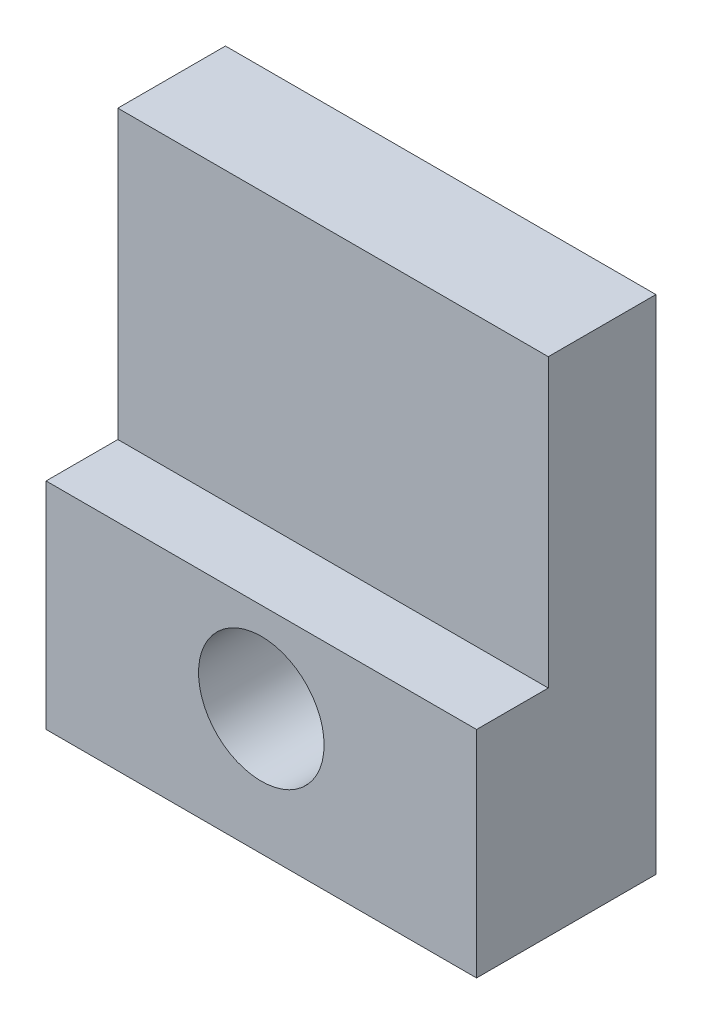
ISO-10303-21;
HEADER;
FILE_DESCRIPTION(('STEP AP214'),'2;1');
FILE_NAME('part.step','',(''),(''),'','','');
FILE_SCHEMA(('AUTOMOTIVE_DESIGN { 1 0 10303 214 1 1 1 1 }'));
ENDSEC;
DATA;
#1=APPLICATION_CONTEXT('core data for automotive mechanical design processes');
#2=APPLICATION_PROTOCOL_DEFINITION('international standard','automotive_design',2000,#1);
#3=PRODUCT_CONTEXT('',#1,'mechanical');
#4=PRODUCT('Part','Part','',(#3));
#5=PRODUCT_RELATED_PRODUCT_CATEGORY('part','',(#4));
#6=PRODUCT_DEFINITION_FORMATION('','',#4);
#7=PRODUCT_DEFINITION_CONTEXT('part definition',#1,'design');
#8=PRODUCT_DEFINITION('design','',#6,#7);
#9=PRODUCT_DEFINITION_SHAPE('','',#8);
#10=(LENGTH_UNIT() NAMED_UNIT(*) SI_UNIT(.MILLI.,.METRE.));
#11=(NAMED_UNIT(*) PLANE_ANGLE_UNIT() SI_UNIT($,.RADIAN.));
#12=(NAMED_UNIT(*) SI_UNIT($,.STERADIAN.) SOLID_ANGLE_UNIT());
#13=UNCERTAINTY_MEASURE_WITH_UNIT(LENGTH_MEASURE(1.E-05),#10,'distance_accuracy_value','');
#14=(GEOMETRIC_REPRESENTATION_CONTEXT(3) GLOBAL_UNCERTAINTY_ASSIGNED_CONTEXT((#13)) GLOBAL_UNIT_ASSIGNED_CONTEXT((#10,
#11,#12)) REPRESENTATION_CONTEXT('',''));
#15=CARTESIAN_POINT('',(0.,0.,0.));
#16=DIRECTION('',(0.,0.,1.));
#17=DIRECTION('',(1.,0.,0.));
#18=AXIS2_PLACEMENT_3D('',#15,#16,#17);
#19=CARTESIAN_POINT('',(-6.00000000000001,7.,5.));
#20=DIRECTION('',(0.,0.,1.));
#21=DIRECTION('',(1.,0.,0.));
#22=AXIS2_PLACEMENT_3D('',#19,#20,#21);
#23=PLANE('',#22);
#24=DIRECTION('',(1.,0.,0.));
#25=VECTOR('',#24,1.);
#26=CARTESIAN_POINT('',(-8.27233997512634,-0.999999999999997,5.));
#27=LINE('',#26,#25);
#28=CARTESIAN_POINT('',(-6.00000000000001,-1.,5.));
#29=VERTEX_POINT('',#28);
#30=CARTESIAN_POINT('',(6.00000000000001,-0.999999999999984,5.));
#31=VERTEX_POINT('',#30);
#32=EDGE_CURVE('E86',#29,#31,#27,.T.);
#33=ORIENTED_EDGE('',*,*,#32,.F.);
#34=DIRECTION('',(0.,-1.,0.));
#35=VECTOR('',#34,1.);
#36=CARTESIAN_POINT('',(-6.00000000000001,7.,5.));
#37=LINE('',#36,#35);
#38=CARTESIAN_POINT('',(-5.99999999999998,-7.00000000000001,5.));
#39=VERTEX_POINT('',#38);
#40=EDGE_CURVE('E95',#29,#39,#37,.T.);
#41=ORIENTED_EDGE('',*,*,#40,.T.);
#42=DIRECTION('',(1.,0.,0.));
#43=VECTOR('',#42,1.);
#44=CARTESIAN_POINT('',(-5.99999999999998,-7.00000000000001,5.));
#45=LINE('',#44,#43);
#46=CARTESIAN_POINT('',(6.00000000000004,-6.99999999999999,5.));
#47=VERTEX_POINT('',#46);
#48=EDGE_CURVE('E51',#39,#47,#45,.T.);
#49=ORIENTED_EDGE('',*,*,#48,.T.);
#50=DIRECTION('',(0.,1.,0.));
#51=VECTOR('',#50,1.);
#52=CARTESIAN_POINT('',(6.00000000000001,7.00000000000003,5.));
#53=LINE('',#52,#51);
#54=EDGE_CURVE('E97',#47,#31,#53,.T.);
#55=ORIENTED_EDGE('',*,*,#54,.T.);
#56=EDGE_LOOP('',(#33,#41,#49,#55));
#57=FACE_BOUND('',#56,.T.);
#58=CARTESIAN_POINT('',(0.,-3.50000000000001,5.));
#59=DIRECTION('',(0.,0.,1.));
#60=DIRECTION('',(1.,0.,0.));
#61=AXIS2_PLACEMENT_3D('',#58,#59,#60);
#62=CIRCLE('',#61,1.75);
#63=CARTESIAN_POINT('',(1.75,-3.50000000000001,5.));
#64=VERTEX_POINT('',#63);
#65=EDGE_CURVE('E134',#64,#64,#62,.T.);
#66=ORIENTED_EDGE('',*,*,#65,.F.);
#67=EDGE_LOOP('',(#66));
#68=FACE_BOUND('',#67,.T.);
#69=ADVANCED_FACE('F28',(#57,#68),#23,.T.);
#70=CARTESIAN_POINT('',(-6.00000000000001,7.,0.));
#71=DIRECTION('',(0.,0.,1.));
#72=DIRECTION('',(1.,0.,0.));
#73=AXIS2_PLACEMENT_3D('',#70,#71,#72);
#74=PLANE('',#73);
#75=DIRECTION('',(0.,-1.,0.));
#76=VECTOR('',#75,1.);
#77=CARTESIAN_POINT('',(-6.00000000000001,7.,0.));
#78=LINE('',#77,#76);
#79=CARTESIAN_POINT('',(-6.00000000000001,7.,0.));
#80=VERTEX_POINT('',#79);
#81=CARTESIAN_POINT('',(-5.99999999999998,-7.00000000000001,0.));
#82=VERTEX_POINT('',#81);
#83=EDGE_CURVE('E133',#80,#82,#78,.T.);
#84=ORIENTED_EDGE('',*,*,#83,.F.);
#85=DIRECTION('',(-1.,0.,0.));
#86=VECTOR('',#85,1.);
#87=CARTESIAN_POINT('',(-6.00000000000001,7.,0.));
#88=LINE('',#87,#86);
#89=CARTESIAN_POINT('',(6.00000000000001,7.00000000000003,0.));
#90=VERTEX_POINT('',#89);
#91=EDGE_CURVE('E103',#90,#80,#88,.T.);
#92=ORIENTED_EDGE('',*,*,#91,.F.);
#93=DIRECTION('',(0.,1.,0.));
#94=VECTOR('',#93,1.);
#95=CARTESIAN_POINT('',(6.00000000000001,7.00000000000003,0.));
#96=LINE('',#95,#94);
#97=CARTESIAN_POINT('',(6.00000000000004,-6.99999999999999,0.));
#98=VERTEX_POINT('',#97);
#99=EDGE_CURVE('E107',#98,#90,#96,.T.);
#100=ORIENTED_EDGE('',*,*,#99,.F.);
#101=DIRECTION('',(1.,0.,0.));
#102=VECTOR('',#101,1.);
#103=CARTESIAN_POINT('',(-5.99999999999998,-7.00000000000001,0.));
#104=LINE('',#103,#102);
#105=EDGE_CURVE('E129',#82,#98,#104,.T.);
#106=ORIENTED_EDGE('',*,*,#105,.F.);
#107=EDGE_LOOP('',(#84,#92,#100,#106));
#108=FACE_BOUND('',#107,.T.);
#109=CARTESIAN_POINT('',(0.,-3.50000000000001,0.));
#110=DIRECTION('',(0.,0.,1.));
#111=DIRECTION('',(1.,0.,0.));
#112=AXIS2_PLACEMENT_3D('',#109,#110,#111);
#113=CIRCLE('',#112,1.75);
#114=CARTESIAN_POINT('',(1.75,-3.50000000000001,0.));
#115=VERTEX_POINT('',#114);
#116=EDGE_CURVE('E91',#115,#115,#113,.T.);
#117=ORIENTED_EDGE('',*,*,#116,.T.);
#118=EDGE_LOOP('',(#117));
#119=FACE_BOUND('',#118,.T.);
#120=ADVANCED_FACE('F131',(#108,#119),#74,.F.);
#121=CARTESIAN_POINT('',(-6.00000000000001,7.,5.));
#122=DIRECTION('',(1.,0.,0.));
#123=DIRECTION('',(0.,1.,0.));
#124=AXIS2_PLACEMENT_3D('',#121,#122,#123);
#125=PLANE('',#124);
#126=ORIENTED_EDGE('',*,*,#40,.F.);
#127=DIRECTION('',(0.,0.,-1.));
#128=VECTOR('',#127,1.);
#129=CARTESIAN_POINT('',(-6.00000000000001,-1.,5.));
#130=LINE('',#129,#128);
#131=CARTESIAN_POINT('',(-6.00000000000001,-1.,3.));
#132=VERTEX_POINT('',#131);
#133=EDGE_CURVE('E83',#29,#132,#130,.T.);
#134=ORIENTED_EDGE('',*,*,#133,.T.);
#135=DIRECTION('',(0.,1.,0.));
#136=VECTOR('',#135,1.);
#137=CARTESIAN_POINT('',(-6.00000000000001,7.,3.));
#138=LINE('',#137,#136);
#139=CARTESIAN_POINT('',(-6.00000000000001,7.,3.));
#140=VERTEX_POINT('',#139);
#141=EDGE_CURVE('E92',#132,#140,#138,.T.);
#142=ORIENTED_EDGE('',*,*,#141,.T.);
#143=DIRECTION('',(0.,0.,-1.));
#144=VECTOR('',#143,1.);
#145=CARTESIAN_POINT('',(-6.00000000000001,7.,5.));
#146=LINE('',#145,#144);
#147=EDGE_CURVE('E112',#140,#80,#146,.T.);
#148=ORIENTED_EDGE('',*,*,#147,.T.);
#149=ORIENTED_EDGE('',*,*,#83,.T.);
#150=DIRECTION('',(0.,0.,-1.));
#151=VECTOR('',#150,1.);
#152=CARTESIAN_POINT('',(-5.99999999999998,-7.00000000000001,5.));
#153=LINE('',#152,#151);
#154=EDGE_CURVE('E102',#39,#82,#153,.T.);
#155=ORIENTED_EDGE('',*,*,#154,.F.);
#156=EDGE_LOOP('',(#126,#134,#142,#148,#149,#155));
#157=FACE_BOUND('',#156,.T.);
#158=ADVANCED_FACE('F30',(#157),#125,.F.);
#159=CARTESIAN_POINT('',(-5.99999999999998,-7.00000000000001,5.));
#160=DIRECTION('',(0.,1.,0.));
#161=DIRECTION('',(-1.,0.,0.));
#162=AXIS2_PLACEMENT_3D('',#159,#160,#161);
#163=PLANE('',#162);
#164=ORIENTED_EDGE('',*,*,#105,.T.);
#165=DIRECTION('',(0.,0.,-1.));
#166=VECTOR('',#165,1.);
#167=CARTESIAN_POINT('',(6.00000000000004,-6.99999999999999,5.));
#168=LINE('',#167,#166);
#169=EDGE_CURVE('E116',#47,#98,#168,.T.);
#170=ORIENTED_EDGE('',*,*,#169,.F.);
#171=ORIENTED_EDGE('',*,*,#48,.F.);
#172=ORIENTED_EDGE('',*,*,#154,.T.);
#173=EDGE_LOOP('',(#164,#170,#171,#172));
#174=FACE_BOUND('',#173,.T.);
#175=ADVANCED_FACE('F163',(#174),#163,.F.);
#176=CARTESIAN_POINT('',(6.00000000000001,7.00000000000003,5.));
#177=DIRECTION('',(-1.,0.,0.));
#178=DIRECTION('',(0.,-1.,0.));
#179=AXIS2_PLACEMENT_3D('',#176,#177,#178);
#180=PLANE('',#179);
#181=DIRECTION('',(0.,-1.,0.));
#182=VECTOR('',#181,1.);
#183=CARTESIAN_POINT('',(6.00000000000001,7.00000000000003,3.));
#184=LINE('',#183,#182);
#185=CARTESIAN_POINT('',(6.00000000000001,7.00000000000003,3.));
#186=VERTEX_POINT('',#185);
#187=CARTESIAN_POINT('',(6.00000000000001,-0.999999999999984,3.));
#188=VERTEX_POINT('',#187);
#189=EDGE_CURVE('E43',#186,#188,#184,.T.);
#190=ORIENTED_EDGE('',*,*,#189,.T.);
#191=DIRECTION('',(0.,0.,1.));
#192=VECTOR('',#191,1.);
#193=CARTESIAN_POINT('',(6.00000000000001,-0.999999999999984,5.));
#194=LINE('',#193,#192);
#195=EDGE_CURVE('E11',#188,#31,#194,.T.);
#196=ORIENTED_EDGE('',*,*,#195,.T.);
#197=ORIENTED_EDGE('',*,*,#54,.F.);
#198=ORIENTED_EDGE('',*,*,#169,.T.);
#199=ORIENTED_EDGE('',*,*,#99,.T.);
#200=DIRECTION('',(0.,0.,-1.));
#201=VECTOR('',#200,1.);
#202=CARTESIAN_POINT('',(6.00000000000001,7.00000000000003,5.));
#203=LINE('',#202,#201);
#204=EDGE_CURVE('E114',#186,#90,#203,.T.);
#205=ORIENTED_EDGE('',*,*,#204,.F.);
#206=EDGE_LOOP('',(#190,#196,#197,#198,#199,#205));
#207=FACE_BOUND('',#206,.T.);
#208=ADVANCED_FACE('F125',(#207),#180,.F.);
#209=CARTESIAN_POINT('',(-6.00000000000001,7.,5.));
#210=DIRECTION('',(0.,-1.,0.));
#211=DIRECTION('',(1.,0.,0.));
#212=AXIS2_PLACEMENT_3D('',#209,#210,#211);
#213=PLANE('',#212);
#214=ORIENTED_EDGE('',*,*,#147,.F.);
#215=DIRECTION('',(1.,0.,0.));
#216=VECTOR('',#215,1.);
#217=CARTESIAN_POINT('',(-6.00000000000001,7.,3.));
#218=LINE('',#217,#216);
#219=EDGE_CURVE('E36',#140,#186,#218,.T.);
#220=ORIENTED_EDGE('',*,*,#219,.T.);
#221=ORIENTED_EDGE('',*,*,#204,.T.);
#222=ORIENTED_EDGE('',*,*,#91,.T.);
#223=EDGE_LOOP('',(#214,#220,#221,#222));
#224=FACE_BOUND('',#223,.T.);
#225=ADVANCED_FACE('F122',(#224),#213,.F.);
#226=CARTESIAN_POINT('',(0.,-3.50000000000001,5.));
#227=DIRECTION('',(0.,0.,-1.));
#228=DIRECTION('',(-1.,0.,0.));
#229=AXIS2_PLACEMENT_3D('',#226,#227,#228);
#230=CYLINDRICAL_SURFACE('',#229,1.75);
#231=ORIENTED_EDGE('',*,*,#65,.T.);
#232=EDGE_LOOP('',(#231));
#233=FACE_BOUND('',#232,.T.);
#234=ORIENTED_EDGE('',*,*,#116,.F.);
#235=EDGE_LOOP('',(#234));
#236=FACE_BOUND('',#235,.T.);
#237=ADVANCED_FACE('F150',(#233,#236),#230,.F.);
#238=CARTESIAN_POINT('',(-8.27233997512634,-0.999999999999997,3.));
#239=DIRECTION('',(0.,-1.,0.));
#240=DIRECTION('',(0.,0.,-1.));
#241=AXIS2_PLACEMENT_3D('',#238,#239,#240);
#242=PLANE('',#241);
#243=ORIENTED_EDGE('',*,*,#32,.T.);
#244=ORIENTED_EDGE('',*,*,#195,.F.);
#245=DIRECTION('',(1.,0.,0.));
#246=VECTOR('',#245,1.);
#247=CARTESIAN_POINT('',(-8.27233997512634,-0.999999999999997,3.));
#248=LINE('',#247,#246);
#249=EDGE_CURVE('E87',#132,#188,#248,.T.);
#250=ORIENTED_EDGE('',*,*,#249,.F.);
#251=ORIENTED_EDGE('',*,*,#133,.F.);
#252=EDGE_LOOP('',(#243,#244,#250,#251));
#253=FACE_BOUND('',#252,.T.);
#254=ADVANCED_FACE('F85',(#253),#242,.F.);
#255=CARTESIAN_POINT('',(-8.27233997512636,9.00000000000001,3.));
#256=DIRECTION('',(0.,0.,-1.));
#257=DIRECTION('',(-1.,0.,0.));
#258=AXIS2_PLACEMENT_3D('',#255,#256,#257);
#259=PLANE('',#258);
#260=ORIENTED_EDGE('',*,*,#249,.T.);
#261=ORIENTED_EDGE('',*,*,#189,.F.);
#262=ORIENTED_EDGE('',*,*,#219,.F.);
#263=ORIENTED_EDGE('',*,*,#141,.F.);
#264=EDGE_LOOP('',(#260,#261,#262,#263));
#265=FACE_BOUND('',#264,.T.);
#266=ADVANCED_FACE('F144',(#265),#259,.F.);
#267=CLOSED_SHELL('',(#69,#120,#158,#175,#208,#225,#237,#254,#266));
#268=MANIFOLD_SOLID_BREP('B2',#267);
#269=ADVANCED_BREP_SHAPE_REPRESENTATION('',(#18,#268),#14);
#270=SHAPE_DEFINITION_REPRESENTATION(#9,#269);
ENDSEC;
END-ISO-10303-21;
